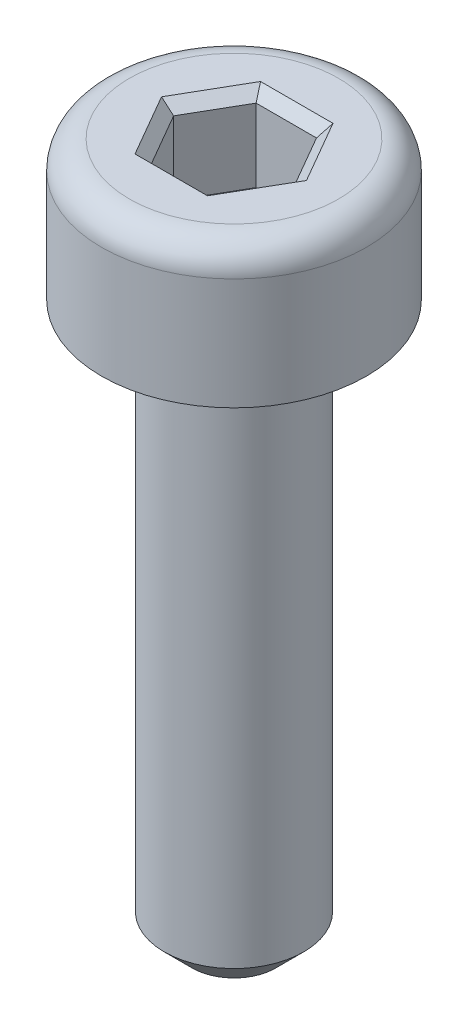
ISO-10303-21;
HEADER;
FILE_DESCRIPTION(('STEP AP214'),'2;1');
FILE_NAME('part.step','',(''),(''),'','','');
FILE_SCHEMA(('AUTOMOTIVE_DESIGN { 1 0 10303 214 1 1 1 1 }'));
ENDSEC;
DATA;
#1=APPLICATION_CONTEXT('core data for automotive mechanical design processes');
#2=APPLICATION_PROTOCOL_DEFINITION('international standard','automotive_design',2000,#1);
#3=PRODUCT_CONTEXT('',#1,'mechanical');
#4=PRODUCT('Part','Part','',(#3));
#5=PRODUCT_RELATED_PRODUCT_CATEGORY('part','',(#4));
#6=PRODUCT_DEFINITION_FORMATION('','',#4);
#7=PRODUCT_DEFINITION_CONTEXT('part definition',#1,'design');
#8=PRODUCT_DEFINITION('design','',#6,#7);
#9=PRODUCT_DEFINITION_SHAPE('','',#8);
#10=(LENGTH_UNIT() NAMED_UNIT(*) SI_UNIT(.MILLI.,.METRE.));
#11=(NAMED_UNIT(*) PLANE_ANGLE_UNIT() SI_UNIT($,.RADIAN.));
#12=(NAMED_UNIT(*) SI_UNIT($,.STERADIAN.) SOLID_ANGLE_UNIT());
#13=UNCERTAINTY_MEASURE_WITH_UNIT(LENGTH_MEASURE(1.E-05),#10,'distance_accuracy_value','');
#14=(GEOMETRIC_REPRESENTATION_CONTEXT(3) GLOBAL_UNCERTAINTY_ASSIGNED_CONTEXT((#13)) GLOBAL_UNIT_ASSIGNED_CONTEXT((#10,
#11,#12)) REPRESENTATION_CONTEXT('',''));
#15=CARTESIAN_POINT('',(0.,0.,0.));
#16=DIRECTION('',(0.,0.,1.));
#17=DIRECTION('',(1.,0.,0.));
#18=AXIS2_PLACEMENT_3D('',#15,#16,#17);
#19=CARTESIAN_POINT('',(0.,2.,0.));
#20=DIRECTION('',(0.,-1.,0.));
#21=DIRECTION('',(0.,0.,-1.));
#22=AXIS2_PLACEMENT_3D('',#19,#20,#21);
#23=PLANE('',#22);
#24=DIRECTION('',(-0.5,0.,-0.866025403784439));
#25=VECTOR('',#24,1.);
#26=CARTESIAN_POINT('',(-0.779422863405996,2.,0.450000000000002));
#27=LINE('',#26,#25);
#28=CARTESIAN_POINT('',(-0.519615242270658,2.,0.900000000000012));
#29=VERTEX_POINT('',#28);
#30=CARTESIAN_POINT('',(-1.03923048454132,2.,0.));
#31=VERTEX_POINT('',#30);
#32=EDGE_CURVE('E180',#29,#31,#27,.T.);
#33=ORIENTED_EDGE('',*,*,#32,.T.);
#34=DIRECTION('',(0.5,0.,-0.866025403784439));
#35=VECTOR('',#34,1.);
#36=CARTESIAN_POINT('',(-0.779422863405985,2.,-0.449999999999996));
#37=LINE('',#36,#35);
#38=CARTESIAN_POINT('',(-0.519615242270658,2.,-0.899999999999987));
#39=VERTEX_POINT('',#38);
#40=EDGE_CURVE('E182',#31,#39,#37,.T.);
#41=ORIENTED_EDGE('',*,*,#40,.T.);
#42=DIRECTION('',(1.,0.,0.));
#43=VECTOR('',#42,1.);
#44=CARTESIAN_POINT('',(0.,2.,-0.899999999999987));
#45=LINE('',#44,#43);
#46=CARTESIAN_POINT('',(0.519615242270667,2.,-0.899999999999987));
#47=VERTEX_POINT('',#46);
#48=EDGE_CURVE('E172',#39,#47,#45,.T.);
#49=ORIENTED_EDGE('',*,*,#48,.T.);
#50=DIRECTION('',(0.5,0.,0.866025403784439));
#51=VECTOR('',#50,1.);
#52=CARTESIAN_POINT('',(0.779422863405993,2.,-0.449999999999998));
#53=LINE('',#52,#51);
#54=CARTESIAN_POINT('',(1.03923048454133,2.,0.));
#55=VERTEX_POINT('',#54);
#56=EDGE_CURVE('E174',#47,#55,#53,.T.);
#57=ORIENTED_EDGE('',*,*,#56,.T.);
#58=DIRECTION('',(-0.5,0.,0.866025403784439));
#59=VECTOR('',#58,1.);
#60=CARTESIAN_POINT('',(0.779422863406003,2.,0.450000000000003));
#61=LINE('',#60,#59);
#62=CARTESIAN_POINT('',(0.519615242270667,2.,0.900000000000012));
#63=VERTEX_POINT('',#62);
#64=EDGE_CURVE('E176',#55,#63,#61,.T.);
#65=ORIENTED_EDGE('',*,*,#64,.T.);
#66=DIRECTION('',(-1.,0.,0.));
#67=VECTOR('',#66,1.);
#68=CARTESIAN_POINT('',(0.,2.,0.900000000000012));
#69=LINE('',#68,#67);
#70=EDGE_CURVE('E178',#63,#29,#69,.T.);
#71=ORIENTED_EDGE('',*,*,#70,.T.);
#72=EDGE_LOOP('',(#33,#41,#49,#57,#65,#71));
#73=FACE_BOUND('',#72,.T.);
#74=CARTESIAN_POINT('',(0.,2.,0.));
#75=DIRECTION('',(0.,1.,0.));
#76=DIRECTION('',(0.,0.,1.));
#77=AXIS2_PLACEMENT_3D('',#74,#75,#76);
#78=CIRCLE('',#77,1.5);
#79=CARTESIAN_POINT('',(0.,2.,1.5));
#80=VERTEX_POINT('',#79);
#81=EDGE_CURVE('E168',#80,#80,#78,.T.);
#82=ORIENTED_EDGE('',*,*,#81,.T.);
#83=EDGE_LOOP('',(#82));
#84=FACE_BOUND('',#83,.T.);
#85=ADVANCED_FACE('F35',(#73,#84),#23,.F.);
#86=CARTESIAN_POINT('',(0.,1.6,0.));
#87=DIRECTION('',(0.,1.,0.));
#88=DIRECTION('',(0.,0.,1.));
#89=AXIS2_PLACEMENT_3D('',#86,#87,#88);
#90=TOROIDAL_SURFACE('',#89,1.5,0.4);
#91=ORIENTED_EDGE('',*,*,#81,.F.);
#92=EDGE_LOOP('',(#91));
#93=FACE_BOUND('',#92,.T.);
#94=CARTESIAN_POINT('',(0.,1.6,0.));
#95=DIRECTION('',(0.,1.,0.));
#96=DIRECTION('',(0.,0.,1.));
#97=AXIS2_PLACEMENT_3D('',#94,#95,#96);
#98=CIRCLE('',#97,1.9);
#99=CARTESIAN_POINT('',(0.,1.6,1.9));
#100=VERTEX_POINT('',#99);
#101=EDGE_CURVE('E165',#100,#100,#98,.T.);
#102=ORIENTED_EDGE('',*,*,#101,.T.);
#103=EDGE_LOOP('',(#102));
#104=FACE_BOUND('',#103,.T.);
#105=ADVANCED_FACE('F236',(#93,#104),#90,.T.);
#106=CARTESIAN_POINT('',(0.,6.97297297297297,0.));
#107=DIRECTION('',(0.,1.,0.));
#108=DIRECTION('',(0.,0.,1.));
#109=AXIS2_PLACEMENT_3D('',#106,#107,#108);
#110=CYLINDRICAL_SURFACE('',#109,1.9);
#111=ORIENTED_EDGE('',*,*,#101,.F.);
#112=EDGE_LOOP('',(#111));
#113=FACE_BOUND('',#112,.T.);
#114=CARTESIAN_POINT('',(0.,0.,0.));
#115=DIRECTION('',(0.,1.,0.));
#116=DIRECTION('',(0.,0.,1.));
#117=AXIS2_PLACEMENT_3D('',#114,#115,#116);
#118=CIRCLE('',#117,1.9);
#119=CARTESIAN_POINT('',(0.,0.,1.9));
#120=VERTEX_POINT('',#119);
#121=EDGE_CURVE('E162',#120,#120,#118,.T.);
#122=ORIENTED_EDGE('',*,*,#121,.T.);
#123=EDGE_LOOP('',(#122));
#124=FACE_BOUND('',#123,.T.);
#125=ADVANCED_FACE('F242',(#113,#124),#110,.T.);
#126=CARTESIAN_POINT('',(1.9,0.,0.));
#127=DIRECTION('',(0.,1.,0.));
#128=DIRECTION('',(0.,0.,1.));
#129=AXIS2_PLACEMENT_3D('',#126,#127,#128);
#130=PLANE('',#129);
#131=ORIENTED_EDGE('',*,*,#121,.F.);
#132=EDGE_LOOP('',(#131));
#133=FACE_BOUND('',#132,.T.);
#134=CARTESIAN_POINT('',(0.,0.,0.));
#135=DIRECTION('',(0.,1.,0.));
#136=DIRECTION('',(0.,0.,1.));
#137=AXIS2_PLACEMENT_3D('',#134,#135,#136);
#138=CIRCLE('',#137,1.);
#139=CARTESIAN_POINT('',(0.,0.,1.));
#140=VERTEX_POINT('',#139);
#141=EDGE_CURVE('E159',#140,#140,#138,.T.);
#142=ORIENTED_EDGE('',*,*,#141,.T.);
#143=EDGE_LOOP('',(#142));
#144=FACE_BOUND('',#143,.T.);
#145=ADVANCED_FACE('F372',(#133,#144),#130,.F.);
#146=CARTESIAN_POINT('',(0.,6.97297297297297,0.));
#147=DIRECTION('',(0.,1.,0.));
#148=DIRECTION('',(0.,0.,1.));
#149=AXIS2_PLACEMENT_3D('',#146,#147,#148);
#150=CYLINDRICAL_SURFACE('',#149,1.);
#151=ORIENTED_EDGE('',*,*,#141,.F.);
#152=EDGE_LOOP('',(#151));
#153=FACE_BOUND('',#152,.T.);
#154=CARTESIAN_POINT('',(0.,-7.6,0.));
#155=DIRECTION('',(0.,1.,0.));
#156=DIRECTION('',(0.,0.,1.));
#157=AXIS2_PLACEMENT_3D('',#154,#155,#156);
#158=CIRCLE('',#157,1.);
#159=CARTESIAN_POINT('',(0.,-7.6,1.));
#160=VERTEX_POINT('',#159);
#161=EDGE_CURVE('E156',#160,#160,#158,.T.);
#162=ORIENTED_EDGE('',*,*,#161,.T.);
#163=EDGE_LOOP('',(#162));
#164=FACE_BOUND('',#163,.T.);
#165=ADVANCED_FACE('F363',(#153,#164),#150,.T.);
#166=CARTESIAN_POINT('',(0.,-8.,0.));
#167=DIRECTION('',(0.,1.,0.));
#168=DIRECTION('',(0.,0.,1.));
#169=AXIS2_PLACEMENT_3D('',#166,#167,#168);
#170=CONICAL_SURFACE('',#169,0.600000000000002,0.785398163397448);
#171=ORIENTED_EDGE('',*,*,#161,.F.);
#172=EDGE_LOOP('',(#171));
#173=FACE_BOUND('',#172,.T.);
#174=CARTESIAN_POINT('',(0.,-8.,0.));
#175=DIRECTION('',(0.,1.,0.));
#176=DIRECTION('',(0.,0.,1.));
#177=AXIS2_PLACEMENT_3D('',#174,#175,#176);
#178=CIRCLE('',#177,0.600000000000002);
#179=CARTESIAN_POINT('',(0.,-8.,0.600000000000002));
#180=VERTEX_POINT('',#179);
#181=EDGE_CURVE('E146',#180,#180,#178,.T.);
#182=ORIENTED_EDGE('',*,*,#181,.T.);
#183=EDGE_LOOP('',(#182));
#184=FACE_BOUND('',#183,.T.);
#185=ADVANCED_FACE('F358',(#173,#184),#170,.T.);
#186=CARTESIAN_POINT('',(0.600000000000002,-8.,0.));
#187=DIRECTION('',(0.,1.,0.));
#188=DIRECTION('',(0.,0.,1.));
#189=AXIS2_PLACEMENT_3D('',#186,#187,#188);
#190=PLANE('',#189);
#191=ORIENTED_EDGE('',*,*,#181,.F.);
#192=EDGE_LOOP('',(#191));
#193=FACE_BOUND('',#192,.T.);
#194=ADVANCED_FACE('F333',(#193),#190,.F.);
#195=CARTESIAN_POINT('',(-0.433012701892215,0.8,-0.749999999999988));
#196=DIRECTION('',(-0.866025403784439,0.,-0.5));
#197=DIRECTION('',(-0.5,0.,0.866025403784439));
#198=AXIS2_PLACEMENT_3D('',#195,#196,#197);
#199=PLANE('',#198);
#200=DIRECTION('',(0.,1.,0.));
#201=VECTOR('',#200,1.);
#202=CARTESIAN_POINT('',(-0.433012701892215,0.8,-0.749999999999988));
#203=LINE('',#202,#201);
#204=CARTESIAN_POINT('',(-0.433012701892215,0.8,-0.749999999999988));
#205=VERTEX_POINT('',#204);
#206=CARTESIAN_POINT('',(-0.433012701892215,1.85,-0.749999999999988));
#207=VERTEX_POINT('',#206);
#208=EDGE_CURVE('E144',#205,#207,#203,.T.);
#209=ORIENTED_EDGE('',*,*,#208,.T.);
#210=DIRECTION('',(-0.5,0.,0.866025403784439));
#211=VECTOR('',#210,1.);
#212=CARTESIAN_POINT('',(-0.433012701892215,1.85,-0.749999999999988));
#213=LINE('',#212,#211);
#214=CARTESIAN_POINT('',(-0.866025403784434,1.85,0.));
#215=VERTEX_POINT('',#214);
#216=EDGE_CURVE('E116',#207,#215,#213,.T.);
#217=ORIENTED_EDGE('',*,*,#216,.T.);
#218=DIRECTION('',(0.,1.,0.));
#219=VECTOR('',#218,1.);
#220=CARTESIAN_POINT('',(-0.866025403784434,0.8,0.));
#221=LINE('',#220,#219);
#222=CARTESIAN_POINT('',(-0.866025403784434,0.8,0.));
#223=VERTEX_POINT('',#222);
#224=EDGE_CURVE('E108',#223,#215,#221,.T.);
#225=ORIENTED_EDGE('',*,*,#224,.F.);
#226=DIRECTION('',(-0.5,0.,0.866025403784439));
#227=VECTOR('',#226,1.);
#228=CARTESIAN_POINT('',(-0.433012701892215,0.8,-0.749999999999988));
#229=LINE('',#228,#227);
#230=EDGE_CURVE('E113',#205,#223,#229,.T.);
#231=ORIENTED_EDGE('',*,*,#230,.F.);
#232=EDGE_LOOP('',(#209,#217,#225,#231));
#233=FACE_BOUND('',#232,.T.);
#234=ADVANCED_FACE('F111',(#233),#199,.F.);
#235=CARTESIAN_POINT('',(0.433012701892224,0.8,-0.749999999999988));
#236=DIRECTION('',(0.,0.,-1.));
#237=DIRECTION('',(-1.,0.,0.));
#238=AXIS2_PLACEMENT_3D('',#235,#236,#237);
#239=PLANE('',#238);
#240=DIRECTION('',(0.,1.,0.));
#241=VECTOR('',#240,1.);
#242=CARTESIAN_POINT('',(0.433012701892224,0.8,-0.749999999999988));
#243=LINE('',#242,#241);
#244=CARTESIAN_POINT('',(0.433012701892224,0.8,-0.749999999999988));
#245=VERTEX_POINT('',#244);
#246=CARTESIAN_POINT('',(0.433012701892224,1.85,-0.749999999999988));
#247=VERTEX_POINT('',#246);
#248=EDGE_CURVE('E147',#245,#247,#243,.T.);
#249=ORIENTED_EDGE('',*,*,#248,.T.);
#250=DIRECTION('',(-1.,0.,0.));
#251=VECTOR('',#250,1.);
#252=CARTESIAN_POINT('',(0.433012701892224,1.85,-0.749999999999988));
#253=LINE('',#252,#251);
#254=EDGE_CURVE('E11',#247,#207,#253,.T.);
#255=ORIENTED_EDGE('',*,*,#254,.T.);
#256=ORIENTED_EDGE('',*,*,#208,.F.);
#257=DIRECTION('',(-1.,0.,0.));
#258=VECTOR('',#257,1.);
#259=CARTESIAN_POINT('',(0.433012701892224,0.8,-0.749999999999988));
#260=LINE('',#259,#258);
#261=EDGE_CURVE('E119',#245,#205,#260,.T.);
#262=ORIENTED_EDGE('',*,*,#261,.F.);
#263=EDGE_LOOP('',(#249,#255,#256,#262));
#264=FACE_BOUND('',#263,.T.);
#265=ADVANCED_FACE('F220',(#264),#239,.F.);
#266=CARTESIAN_POINT('',(0.866025403784443,0.8,0.));
#267=DIRECTION('',(0.866025403784438,0.,-0.5));
#268=DIRECTION('',(-0.5,0.,-0.866025403784439));
#269=AXIS2_PLACEMENT_3D('',#266,#267,#268);
#270=PLANE('',#269);
#271=DIRECTION('',(0.,1.,0.));
#272=VECTOR('',#271,1.);
#273=CARTESIAN_POINT('',(0.866025403784443,0.8,0.));
#274=LINE('',#273,#272);
#275=CARTESIAN_POINT('',(0.866025403784443,0.8,0.));
#276=VERTEX_POINT('',#275);
#277=CARTESIAN_POINT('',(0.866025403784443,1.85,0.));
#278=VERTEX_POINT('',#277);
#279=EDGE_CURVE('E149',#276,#278,#274,.T.);
#280=ORIENTED_EDGE('',*,*,#279,.T.);
#281=DIRECTION('',(-0.5,0.,-0.866025403784439));
#282=VECTOR('',#281,1.);
#283=CARTESIAN_POINT('',(0.866025403784443,1.85,0.));
#284=LINE('',#283,#282);
#285=EDGE_CURVE('E44',#278,#247,#284,.T.);
#286=ORIENTED_EDGE('',*,*,#285,.T.);
#287=ORIENTED_EDGE('',*,*,#248,.F.);
#288=DIRECTION('',(-0.5,0.,-0.866025403784439));
#289=VECTOR('',#288,1.);
#290=CARTESIAN_POINT('',(0.866025403784443,0.8,0.));
#291=LINE('',#290,#289);
#292=EDGE_CURVE('E141',#276,#245,#291,.T.);
#293=ORIENTED_EDGE('',*,*,#292,.F.);
#294=EDGE_LOOP('',(#280,#286,#287,#293));
#295=FACE_BOUND('',#294,.T.);
#296=ADVANCED_FACE('F222',(#295),#270,.F.);
#297=CARTESIAN_POINT('',(0.433012701892224,0.8,0.750000000000013));
#298=DIRECTION('',(0.866025403784439,0.,0.5));
#299=DIRECTION('',(0.5,0.,-0.866025403784439));
#300=AXIS2_PLACEMENT_3D('',#297,#298,#299);
#301=PLANE('',#300);
#302=DIRECTION('',(0.,1.,0.));
#303=VECTOR('',#302,1.);
#304=CARTESIAN_POINT('',(0.433012701892224,0.8,0.750000000000013));
#305=LINE('',#304,#303);
#306=CARTESIAN_POINT('',(0.433012701892224,0.8,0.750000000000013));
#307=VERTEX_POINT('',#306);
#308=CARTESIAN_POINT('',(0.433012701892224,1.85,0.750000000000013));
#309=VERTEX_POINT('',#308);
#310=EDGE_CURVE('E151',#307,#309,#305,.T.);
#311=ORIENTED_EDGE('',*,*,#310,.T.);
#312=DIRECTION('',(0.5,0.,-0.866025403784439));
#313=VECTOR('',#312,1.);
#314=CARTESIAN_POINT('',(0.433012701892224,1.85,0.750000000000013));
#315=LINE('',#314,#313);
#316=EDGE_CURVE('E59',#309,#278,#315,.T.);
#317=ORIENTED_EDGE('',*,*,#316,.T.);
#318=ORIENTED_EDGE('',*,*,#279,.F.);
#319=DIRECTION('',(0.5,0.,-0.866025403784439));
#320=VECTOR('',#319,1.);
#321=CARTESIAN_POINT('',(0.433012701892224,0.8,0.750000000000013));
#322=LINE('',#321,#320);
#323=EDGE_CURVE('E138',#307,#276,#322,.T.);
#324=ORIENTED_EDGE('',*,*,#323,.F.);
#325=EDGE_LOOP('',(#311,#317,#318,#324));
#326=FACE_BOUND('',#325,.T.);
#327=ADVANCED_FACE('F224',(#326),#301,.F.);
#328=CARTESIAN_POINT('',(-0.433012701892215,0.8,0.750000000000013));
#329=DIRECTION('',(0.,0.,1.));
#330=DIRECTION('',(1.,0.,0.));
#331=AXIS2_PLACEMENT_3D('',#328,#329,#330);
#332=PLANE('',#331);
#333=DIRECTION('',(0.,1.,0.));
#334=VECTOR('',#333,1.);
#335=CARTESIAN_POINT('',(-0.433012701892215,0.8,0.750000000000013));
#336=LINE('',#335,#334);
#337=CARTESIAN_POINT('',(-0.433012701892215,0.8,0.750000000000013));
#338=VERTEX_POINT('',#337);
#339=CARTESIAN_POINT('',(-0.433012701892215,1.85,0.750000000000013));
#340=VERTEX_POINT('',#339);
#341=EDGE_CURVE('E118',#338,#340,#336,.T.);
#342=ORIENTED_EDGE('',*,*,#341,.T.);
#343=DIRECTION('',(1.,0.,0.));
#344=VECTOR('',#343,1.);
#345=CARTESIAN_POINT('',(-0.433012701892215,1.85,0.750000000000013));
#346=LINE('',#345,#344);
#347=EDGE_CURVE('E187',#340,#309,#346,.T.);
#348=ORIENTED_EDGE('',*,*,#347,.T.);
#349=ORIENTED_EDGE('',*,*,#310,.F.);
#350=DIRECTION('',(1.,0.,0.));
#351=VECTOR('',#350,1.);
#352=CARTESIAN_POINT('',(-0.433012701892215,0.8,0.750000000000013));
#353=LINE('',#352,#351);
#354=EDGE_CURVE('E128',#338,#307,#353,.T.);
#355=ORIENTED_EDGE('',*,*,#354,.F.);
#356=EDGE_LOOP('',(#342,#348,#349,#355));
#357=FACE_BOUND('',#356,.T.);
#358=ADVANCED_FACE('F226',(#357),#332,.F.);
#359=CARTESIAN_POINT('',(-0.866025403784434,0.8,0.));
#360=DIRECTION('',(-0.866025403784439,0.,0.5));
#361=DIRECTION('',(0.5,0.,0.866025403784439));
#362=AXIS2_PLACEMENT_3D('',#359,#360,#361);
#363=PLANE('',#362);
#364=ORIENTED_EDGE('',*,*,#224,.T.);
#365=DIRECTION('',(0.5,0.,0.866025403784439));
#366=VECTOR('',#365,1.);
#367=CARTESIAN_POINT('',(-0.866025403784434,1.85,0.));
#368=LINE('',#367,#366);
#369=EDGE_CURVE('E185',#215,#340,#368,.T.);
#370=ORIENTED_EDGE('',*,*,#369,.T.);
#371=ORIENTED_EDGE('',*,*,#341,.F.);
#372=DIRECTION('',(0.5,0.,0.866025403784439));
#373=VECTOR('',#372,1.);
#374=CARTESIAN_POINT('',(-0.866025403784434,0.8,0.));
#375=LINE('',#374,#373);
#376=EDGE_CURVE('E122',#223,#338,#375,.T.);
#377=ORIENTED_EDGE('',*,*,#376,.F.);
#378=EDGE_LOOP('',(#364,#370,#371,#377));
#379=FACE_BOUND('',#378,.T.);
#380=ADVANCED_FACE('F123',(#379),#363,.F.);
#381=CARTESIAN_POINT('',(0.,0.8,0.));
#382=DIRECTION('',(0.,1.,0.));
#383=DIRECTION('',(0.,0.,1.));
#384=AXIS2_PLACEMENT_3D('',#381,#382,#383);
#385=PLANE('',#384);
#386=ORIENTED_EDGE('',*,*,#230,.T.);
#387=ORIENTED_EDGE('',*,*,#376,.T.);
#388=ORIENTED_EDGE('',*,*,#354,.T.);
#389=ORIENTED_EDGE('',*,*,#323,.T.);
#390=ORIENTED_EDGE('',*,*,#292,.T.);
#391=ORIENTED_EDGE('',*,*,#261,.T.);
#392=EDGE_LOOP('',(#386,#387,#388,#389,#390,#391));
#393=FACE_BOUND('',#392,.T.);
#394=ADVANCED_FACE('F130',(#393),#385,.T.);
#395=CARTESIAN_POINT('',(0.433012701892224,1.85,0.750000000000013));
#396=DIRECTION('',(0.612372435695795,-0.707106781186547,0.353553390593274));
#397=DIRECTION('',(0.5,0.,-0.866025403784439));
#398=AXIS2_PLACEMENT_3D('',#395,#396,#397);
#399=PLANE('',#398);
#400=DIRECTION('',(0.377964473009227,0.654653670707977,0.654653670707977));
#401=VECTOR('',#400,1.);
#402=CARTESIAN_POINT('',(0.309294787065876,1.63571428571429,0.535714285714299));
#403=LINE('',#402,#401);
#404=EDGE_CURVE('E135',#63,#309,#403,.F.);
#405=ORIENTED_EDGE('',*,*,#404,.F.);
#406=ORIENTED_EDGE('',*,*,#64,.F.);
#407=DIRECTION('',(0.755928946018454,0.654653670707977,0.));
#408=VECTOR('',#407,1.);
#409=CARTESIAN_POINT('',(0.618589574131746,1.63571428571429,0.));
#410=LINE('',#409,#408);
#411=EDGE_CURVE('E39',#278,#55,#410,.T.);
#412=ORIENTED_EDGE('',*,*,#411,.F.);
#413=ORIENTED_EDGE('',*,*,#316,.F.);
#414=EDGE_LOOP('',(#405,#406,#412,#413));
#415=FACE_BOUND('',#414,.T.);
#416=ADVANCED_FACE('F37',(#415),#399,.F.);
#417=CARTESIAN_POINT('',(0.866025403784443,1.85,0.));
#418=DIRECTION('',(0.612372435695794,-0.707106781186547,-0.353553390593274));
#419=DIRECTION('',(-0.5,0.,-0.866025403784439));
#420=AXIS2_PLACEMENT_3D('',#417,#418,#419);
#421=PLANE('',#420);
#422=ORIENTED_EDGE('',*,*,#411,.T.);
#423=ORIENTED_EDGE('',*,*,#56,.F.);
#424=DIRECTION('',(0.377964473009227,0.654653670707977,-0.654653670707977));
#425=VECTOR('',#424,1.);
#426=CARTESIAN_POINT('',(0.309294787065875,1.63571428571429,-0.535714285714274));
#427=LINE('',#426,#425);
#428=EDGE_CURVE('E198',#247,#47,#427,.T.);
#429=ORIENTED_EDGE('',*,*,#428,.F.);
#430=ORIENTED_EDGE('',*,*,#285,.F.);
#431=EDGE_LOOP('',(#422,#423,#429,#430));
#432=FACE_BOUND('',#431,.T.);
#433=ADVANCED_FACE('F213',(#432),#421,.F.);
#434=CARTESIAN_POINT('',(-0.433012701892215,1.85,0.750000000000013));
#435=DIRECTION('',(0.,-0.707106781186547,0.707106781186547));
#436=DIRECTION('',(1.,0.,0.));
#437=AXIS2_PLACEMENT_3D('',#434,#435,#436);
#438=PLANE('',#437);
#439=ORIENTED_EDGE('',*,*,#404,.T.);
#440=ORIENTED_EDGE('',*,*,#347,.F.);
#441=DIRECTION('',(-0.377964473009228,0.654653670707977,0.654653670707977));
#442=VECTOR('',#441,1.);
#443=CARTESIAN_POINT('',(-0.309294787065867,1.63571428571429,0.535714285714298));
#444=LINE('',#443,#442);
#445=EDGE_CURVE('E195',#29,#340,#444,.F.);
#446=ORIENTED_EDGE('',*,*,#445,.F.);
#447=ORIENTED_EDGE('',*,*,#70,.F.);
#448=EDGE_LOOP('',(#439,#440,#446,#447));
#449=FACE_BOUND('',#448,.T.);
#450=ADVANCED_FACE('F205',(#449),#438,.F.);
#451=CARTESIAN_POINT('',(0.433012701892224,1.85,-0.749999999999988));
#452=DIRECTION('',(0.,-0.707106781186547,-0.707106781186547));
#453=DIRECTION('',(-1.,0.,0.));
#454=AXIS2_PLACEMENT_3D('',#451,#452,#453);
#455=PLANE('',#454);
#456=ORIENTED_EDGE('',*,*,#428,.T.);
#457=ORIENTED_EDGE('',*,*,#48,.F.);
#458=DIRECTION('',(0.377964473009227,-0.654653670707977,0.654653670707977));
#459=VECTOR('',#458,1.);
#460=CARTESIAN_POINT('',(-0.433012701892215,1.85,-0.749999999999988));
#461=LINE('',#460,#459);
#462=EDGE_CURVE('E193',#207,#39,#461,.F.);
#463=ORIENTED_EDGE('',*,*,#462,.F.);
#464=ORIENTED_EDGE('',*,*,#254,.F.);
#465=EDGE_LOOP('',(#456,#457,#463,#464));
#466=FACE_BOUND('',#465,.T.);
#467=ADVANCED_FACE('F218',(#466),#455,.F.);
#468=CARTESIAN_POINT('',(-0.866025403784434,1.85,0.));
#469=DIRECTION('',(-0.612372435695794,-0.707106781186548,0.353553390593274));
#470=DIRECTION('',(0.5,0.,0.866025403784439));
#471=AXIS2_PLACEMENT_3D('',#468,#469,#470);
#472=PLANE('',#471);
#473=ORIENTED_EDGE('',*,*,#445,.T.);
#474=ORIENTED_EDGE('',*,*,#369,.F.);
#475=DIRECTION('',(-0.755928946018455,0.654653670707977,0.));
#476=VECTOR('',#475,1.);
#477=CARTESIAN_POINT('',(-0.618589574131737,1.63571428571429,0.));
#478=LINE('',#477,#476);
#479=EDGE_CURVE('E191',#31,#215,#478,.F.);
#480=ORIENTED_EDGE('',*,*,#479,.F.);
#481=ORIENTED_EDGE('',*,*,#32,.F.);
#482=EDGE_LOOP('',(#473,#474,#480,#481));
#483=FACE_BOUND('',#482,.T.);
#484=ADVANCED_FACE('F251',(#483),#472,.F.);
#485=CARTESIAN_POINT('',(-0.433012701892215,1.85,-0.749999999999988));
#486=DIRECTION('',(-0.612372435695795,-0.707106781186547,-0.353553390593274));
#487=DIRECTION('',(-0.5,0.,0.866025403784439));
#488=AXIS2_PLACEMENT_3D('',#485,#486,#487);
#489=PLANE('',#488);
#490=ORIENTED_EDGE('',*,*,#462,.T.);
#491=ORIENTED_EDGE('',*,*,#40,.F.);
#492=ORIENTED_EDGE('',*,*,#479,.T.);
#493=ORIENTED_EDGE('',*,*,#216,.F.);
#494=EDGE_LOOP('',(#490,#491,#492,#493));
#495=FACE_BOUND('',#494,.T.);
#496=ADVANCED_FACE('F248',(#495),#489,.F.);
#497=CLOSED_SHELL('',(#85,#105,#125,#145,#165,#185,#194,#234,#265,#296,#327,#358,#380,#394,#416,
#433,#450,#467,#484,#496));
#498=MANIFOLD_SOLID_BREP('B2',#497);
#499=ADVANCED_BREP_SHAPE_REPRESENTATION('',(#18,#498),#14);
#500=SHAPE_DEFINITION_REPRESENTATION(#9,#499);
ENDSEC;
END-ISO-10303-21;
